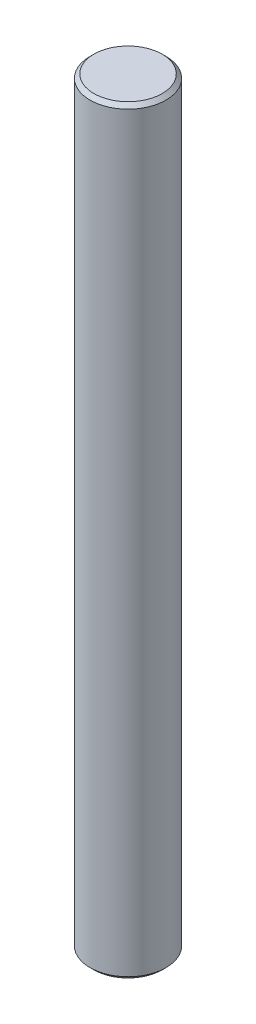
ISO-10303-21;
HEADER;
FILE_DESCRIPTION(('STEP AP214'),'2;1');
FILE_NAME('part.step','',(''),(''),'','','');
FILE_SCHEMA(('AUTOMOTIVE_DESIGN { 1 0 10303 214 1 1 1 1 }'));
ENDSEC;
DATA;
#1=APPLICATION_CONTEXT('core data for automotive mechanical design processes');
#2=APPLICATION_PROTOCOL_DEFINITION('international standard','automotive_design',2000,#1);
#3=PRODUCT_CONTEXT('',#1,'mechanical');
#4=PRODUCT('Part','Part','',(#3));
#5=PRODUCT_RELATED_PRODUCT_CATEGORY('part','',(#4));
#6=PRODUCT_DEFINITION_FORMATION('','',#4);
#7=PRODUCT_DEFINITION_CONTEXT('part definition',#1,'design');
#8=PRODUCT_DEFINITION('design','',#6,#7);
#9=PRODUCT_DEFINITION_SHAPE('','',#8);
#10=(LENGTH_UNIT() NAMED_UNIT(*) SI_UNIT(.MILLI.,.METRE.));
#11=(NAMED_UNIT(*) PLANE_ANGLE_UNIT() SI_UNIT($,.RADIAN.));
#12=(NAMED_UNIT(*) SI_UNIT($,.STERADIAN.) SOLID_ANGLE_UNIT());
#13=UNCERTAINTY_MEASURE_WITH_UNIT(LENGTH_MEASURE(1.E-05),#10,'distance_accuracy_value','');
#14=(GEOMETRIC_REPRESENTATION_CONTEXT(3) GLOBAL_UNCERTAINTY_ASSIGNED_CONTEXT((#13)) GLOBAL_UNIT_ASSIGNED_CONTEXT((#10,
#11,#12)) REPRESENTATION_CONTEXT('',''));
#15=CARTESIAN_POINT('',(0.,0.,0.));
#16=DIRECTION('',(0.,0.,1.));
#17=DIRECTION('',(1.,0.,0.));
#18=AXIS2_PLACEMENT_3D('',#15,#16,#17);
#19=CARTESIAN_POINT('',(-1.80000000000001,20.,1.80000013817222));
#20=DIRECTION('',(0.,1.,0.));
#21=DIRECTION('',(1.,0.,0.));
#22=AXIS2_PLACEMENT_3D('',#19,#20,#21);
#23=PLANE('',#22);
#24=CARTESIAN_POINT('',(0.,20.,0.));
#25=DIRECTION('',(0.,1.,0.));
#26=DIRECTION('',(0.,0.,-1.));
#27=AXIS2_PLACEMENT_3D('',#24,#25,#26);
#28=CIRCLE('',#27,1.8);
#29=CARTESIAN_POINT('',(0.,20.,-1.8));
#30=VERTEX_POINT('',#29);
#31=EDGE_CURVE('E29',#30,#30,#28,.F.);
#32=ORIENTED_EDGE('',*,*,#31,.F.);
#33=EDGE_LOOP('',(#32));
#34=FACE_BOUND('',#33,.T.);
#35=ADVANCED_FACE('F14',(#34),#23,.T.);
#36=CARTESIAN_POINT('',(-1.8,-20.,-1.8));
#37=DIRECTION('',(0.,-1.,0.));
#38=DIRECTION('',(1.,0.,0.));
#39=AXIS2_PLACEMENT_3D('',#36,#37,#38);
#40=PLANE('',#39);
#41=CARTESIAN_POINT('',(0.,-20.,0.));
#42=DIRECTION('',(0.,-1.,0.));
#43=DIRECTION('',(0.,0.,1.));
#44=AXIS2_PLACEMENT_3D('',#41,#42,#43);
#45=CIRCLE('',#44,1.80000000000001);
#46=CARTESIAN_POINT('',(0.,-20.,1.80000000000001));
#47=VERTEX_POINT('',#46);
#48=EDGE_CURVE('E25',#47,#47,#45,.T.);
#49=ORIENTED_EDGE('',*,*,#48,.T.);
#50=EDGE_LOOP('',(#49));
#51=FACE_BOUND('',#50,.T.);
#52=ADVANCED_FACE('F38',(#51),#40,.T.);
#53=CARTESIAN_POINT('',(0.,19.8,0.));
#54=DIRECTION('',(0.,-1.,0.));
#55=DIRECTION('',(1.42036729611557E-07,0.,0.99999999999999));
#56=AXIS2_PLACEMENT_3D('',#53,#54,#55);
#57=CONICAL_SURFACE('',#56,2.,0.78539816339745);
#58=CARTESIAN_POINT('',(0.,19.8,0.));
#59=DIRECTION('',(0.,1.,0.));
#60=DIRECTION('',(0.,0.,-1.));
#61=AXIS2_PLACEMENT_3D('',#58,#59,#60);
#62=CIRCLE('',#61,2.);
#63=CARTESIAN_POINT('',(0.,19.8,-2.));
#64=VERTEX_POINT('',#63);
#65=EDGE_CURVE('E21',#64,#64,#62,.F.);
#66=ORIENTED_EDGE('',*,*,#65,.F.);
#67=EDGE_LOOP('',(#66));
#68=FACE_BOUND('',#67,.T.);
#69=ORIENTED_EDGE('',*,*,#31,.T.);
#70=EDGE_LOOP('',(#69));
#71=FACE_BOUND('',#70,.T.);
#72=ADVANCED_FACE('F35',(#68,#71),#57,.T.);
#73=CARTESIAN_POINT('',(0.,-20.,0.));
#74=DIRECTION('',(0.,-1.,0.));
#75=DIRECTION('',(7.69313624256337E-10,0.,1.));
#76=AXIS2_PLACEMENT_3D('',#73,#74,#75);
#77=CYLINDRICAL_SURFACE('',#76,2.);
#78=CARTESIAN_POINT('',(0.,-19.8,0.));
#79=DIRECTION('',(0.,1.,0.));
#80=DIRECTION('',(0.,0.,-1.));
#81=AXIS2_PLACEMENT_3D('',#78,#79,#80);
#82=CIRCLE('',#81,2.);
#83=CARTESIAN_POINT('',(0.,-19.8,-2.));
#84=VERTEX_POINT('',#83);
#85=EDGE_CURVE('E10',#84,#84,#82,.F.);
#86=ORIENTED_EDGE('',*,*,#85,.F.);
#87=EDGE_LOOP('',(#86));
#88=FACE_BOUND('',#87,.T.);
#89=ORIENTED_EDGE('',*,*,#65,.T.);
#90=EDGE_LOOP('',(#89));
#91=FACE_BOUND('',#90,.T.);
#92=ADVANCED_FACE('F48',(#88,#91),#77,.T.);
#93=CARTESIAN_POINT('',(0.,-19.8,0.));
#94=DIRECTION('',(0.,1.,0.));
#95=DIRECTION('',(0.,0.,-1.));
#96=AXIS2_PLACEMENT_3D('',#93,#94,#95);
#97=CONICAL_SURFACE('',#96,2.,0.785398163397433);
#98=ORIENTED_EDGE('',*,*,#48,.F.);
#99=EDGE_LOOP('',(#98));
#100=FACE_BOUND('',#99,.T.);
#101=ORIENTED_EDGE('',*,*,#85,.T.);
#102=EDGE_LOOP('',(#101));
#103=FACE_BOUND('',#102,.T.);
#104=ADVANCED_FACE('F16',(#100,#103),#97,.T.);
#105=CLOSED_SHELL('',(#35,#52,#72,#92,#104));
#106=MANIFOLD_SOLID_BREP('B1',#105);
#107=ADVANCED_BREP_SHAPE_REPRESENTATION('',(#18,#106),#14);
#108=SHAPE_DEFINITION_REPRESENTATION(#9,#107);
ENDSEC;
END-ISO-10303-21;
